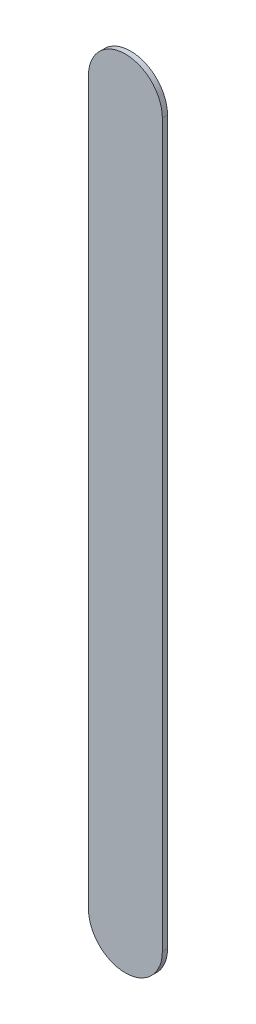
ISO-10303-21;
HEADER;
FILE_DESCRIPTION(('STEP AP214'),'2;1');
FILE_NAME('part.step','',(''),(''),'','','');
FILE_SCHEMA(('AUTOMOTIVE_DESIGN { 1 0 10303 214 1 1 1 1 }'));
ENDSEC;
DATA;
#1=APPLICATION_CONTEXT('core data for automotive mechanical design processes');
#2=APPLICATION_PROTOCOL_DEFINITION('international standard','automotive_design',2000,#1);
#3=PRODUCT_CONTEXT('',#1,'mechanical');
#4=PRODUCT('Part','Part','',(#3));
#5=PRODUCT_RELATED_PRODUCT_CATEGORY('part','',(#4));
#6=PRODUCT_DEFINITION_FORMATION('','',#4);
#7=PRODUCT_DEFINITION_CONTEXT('part definition',#1,'design');
#8=PRODUCT_DEFINITION('design','',#6,#7);
#9=PRODUCT_DEFINITION_SHAPE('','',#8);
#10=(LENGTH_UNIT() NAMED_UNIT(*) SI_UNIT(.MILLI.,.METRE.));
#11=(NAMED_UNIT(*) PLANE_ANGLE_UNIT() SI_UNIT($,.RADIAN.));
#12=(NAMED_UNIT(*) SI_UNIT($,.STERADIAN.) SOLID_ANGLE_UNIT());
#13=UNCERTAINTY_MEASURE_WITH_UNIT(LENGTH_MEASURE(1.E-05),#10,'distance_accuracy_value','');
#14=(GEOMETRIC_REPRESENTATION_CONTEXT(3) GLOBAL_UNCERTAINTY_ASSIGNED_CONTEXT((#13)) GLOBAL_UNIT_ASSIGNED_CONTEXT((#10,
#11,#12)) REPRESENTATION_CONTEXT('',''));
#15=CARTESIAN_POINT('',(0.,0.,0.));
#16=DIRECTION('',(0.,0.,1.));
#17=DIRECTION('',(1.,0.,0.));
#18=AXIS2_PLACEMENT_3D('',#15,#16,#17);
#19=CARTESIAN_POINT('',(75.75,-119.,1.635));
#20=DIRECTION('',(0.,0.,1.));
#21=DIRECTION('',(1.,0.,0.));
#22=AXIS2_PLACEMENT_3D('',#19,#20,#21);
#23=PLANE('',#22);
#24=DIRECTION('',(0.,1.,0.));
#25=VECTOR('',#24,1.);
#26=CARTESIAN_POINT('',(75.75,-119.,1.635));
#27=LINE('',#26,#25);
#28=CARTESIAN_POINT('',(75.75,-119.,1.635));
#29=VERTEX_POINT('',#28);
#30=CARTESIAN_POINT('',(75.75,-114.11,1.635));
#31=VERTEX_POINT('',#30);
#32=EDGE_CURVE('E87',#29,#31,#27,.T.);
#33=ORIENTED_EDGE('',*,*,#32,.T.);
#34=CARTESIAN_POINT('',(75.5,-114.11,1.635));
#35=DIRECTION('',(0.,0.,1.));
#36=DIRECTION('',(1.,0.,0.));
#37=AXIS2_PLACEMENT_3D('',#34,#35,#36);
#38=CIRCLE('',#37,0.25);
#39=CARTESIAN_POINT('',(75.25,-114.11,1.635));
#40=VERTEX_POINT('',#39);
#41=EDGE_CURVE('E105',#31,#40,#38,.T.);
#42=ORIENTED_EDGE('',*,*,#41,.T.);
#43=DIRECTION('',(0.,-1.,0.));
#44=VECTOR('',#43,1.);
#45=CARTESIAN_POINT('',(75.25,-114.11,1.635));
#46=LINE('',#45,#44);
#47=CARTESIAN_POINT('',(75.25,-119.,1.635));
#48=VERTEX_POINT('',#47);
#49=EDGE_CURVE('E49',#40,#48,#46,.T.);
#50=ORIENTED_EDGE('',*,*,#49,.T.);
#51=CARTESIAN_POINT('',(75.5,-119.,1.635));
#52=DIRECTION('',(0.,0.,1.));
#53=DIRECTION('',(-1.,0.,0.));
#54=AXIS2_PLACEMENT_3D('',#51,#52,#53);
#55=CIRCLE('',#54,0.25);
#56=EDGE_CURVE('E11',#48,#29,#55,.T.);
#57=ORIENTED_EDGE('',*,*,#56,.T.);
#58=EDGE_LOOP('',(#33,#42,#50,#57));
#59=FACE_BOUND('',#58,.T.);
#60=ADVANCED_FACE('F17',(#59),#23,.T.);
#61=CARTESIAN_POINT('',(75.75,-119.,1.6));
#62=DIRECTION('',(0.,0.,1.));
#63=DIRECTION('',(1.,0.,0.));
#64=AXIS2_PLACEMENT_3D('',#61,#62,#63);
#65=PLANE('',#64);
#66=CARTESIAN_POINT('',(75.5,-119.,1.6));
#67=DIRECTION('',(0.,0.,1.));
#68=DIRECTION('',(-1.,0.,0.));
#69=AXIS2_PLACEMENT_3D('',#66,#67,#68);
#70=CIRCLE('',#69,0.25);
#71=CARTESIAN_POINT('',(75.25,-119.,1.6));
#72=VERTEX_POINT('',#71);
#73=CARTESIAN_POINT('',(75.75,-119.,1.6));
#74=VERTEX_POINT('',#73);
#75=EDGE_CURVE('E26',#72,#74,#70,.T.);
#76=ORIENTED_EDGE('',*,*,#75,.F.);
#77=DIRECTION('',(0.,-1.,0.));
#78=VECTOR('',#77,1.);
#79=CARTESIAN_POINT('',(75.25,-114.11,1.6));
#80=LINE('',#79,#78);
#81=CARTESIAN_POINT('',(75.25,-114.11,1.6));
#82=VERTEX_POINT('',#81);
#83=EDGE_CURVE('E58',#82,#72,#80,.T.);
#84=ORIENTED_EDGE('',*,*,#83,.F.);
#85=CARTESIAN_POINT('',(75.5,-114.11,1.6));
#86=DIRECTION('',(0.,0.,1.));
#87=DIRECTION('',(1.,0.,0.));
#88=AXIS2_PLACEMENT_3D('',#85,#86,#87);
#89=CIRCLE('',#88,0.25);
#90=CARTESIAN_POINT('',(75.75,-114.11,1.6));
#91=VERTEX_POINT('',#90);
#92=EDGE_CURVE('E89',#91,#82,#89,.T.);
#93=ORIENTED_EDGE('',*,*,#92,.F.);
#94=DIRECTION('',(0.,1.,0.));
#95=VECTOR('',#94,1.);
#96=CARTESIAN_POINT('',(75.75,-119.,1.6));
#97=LINE('',#96,#95);
#98=EDGE_CURVE('E86',#74,#91,#97,.T.);
#99=ORIENTED_EDGE('',*,*,#98,.F.);
#100=EDGE_LOOP('',(#76,#84,#93,#99));
#101=FACE_BOUND('',#100,.T.);
#102=ADVANCED_FACE('F91',(#101),#65,.F.);
#103=CARTESIAN_POINT('',(75.5,-119.,1.6));
#104=DIRECTION('',(0.,0.,-1.));
#105=DIRECTION('',(-1.,0.,0.));
#106=AXIS2_PLACEMENT_3D('',#103,#104,#105);
#107=CYLINDRICAL_SURFACE('',#106,0.25);
#108=ORIENTED_EDGE('',*,*,#75,.T.);
#109=DIRECTION('',(0.,0.,1.));
#110=VECTOR('',#109,1.);
#111=CARTESIAN_POINT('',(75.75,-119.,1.6));
#112=LINE('',#111,#110);
#113=EDGE_CURVE('E76',#74,#29,#112,.T.);
#114=ORIENTED_EDGE('',*,*,#113,.T.);
#115=ORIENTED_EDGE('',*,*,#56,.F.);
#116=DIRECTION('',(0.,0.,1.));
#117=VECTOR('',#116,1.);
#118=CARTESIAN_POINT('',(75.25,-119.,1.6));
#119=LINE('',#118,#117);
#120=EDGE_CURVE('E78',#72,#48,#119,.T.);
#121=ORIENTED_EDGE('',*,*,#120,.F.);
#122=EDGE_LOOP('',(#108,#114,#115,#121));
#123=FACE_BOUND('',#122,.T.);
#124=ADVANCED_FACE('F75',(#123),#107,.T.);
#125=CARTESIAN_POINT('',(75.25,-114.11,1.6));
#126=DIRECTION('',(1.,0.,0.));
#127=DIRECTION('',(0.,1.,0.));
#128=AXIS2_PLACEMENT_3D('',#125,#126,#127);
#129=PLANE('',#128);
#130=ORIENTED_EDGE('',*,*,#83,.T.);
#131=ORIENTED_EDGE('',*,*,#120,.T.);
#132=ORIENTED_EDGE('',*,*,#49,.F.);
#133=DIRECTION('',(0.,0.,1.));
#134=VECTOR('',#133,1.);
#135=CARTESIAN_POINT('',(75.25,-114.11,1.6));
#136=LINE('',#135,#134);
#137=EDGE_CURVE('E110',#82,#40,#136,.T.);
#138=ORIENTED_EDGE('',*,*,#137,.F.);
#139=EDGE_LOOP('',(#130,#131,#132,#138));
#140=FACE_BOUND('',#139,.T.);
#141=ADVANCED_FACE('F120',(#140),#129,.F.);
#142=CARTESIAN_POINT('',(75.5,-114.11,1.6));
#143=DIRECTION('',(0.,0.,-1.));
#144=DIRECTION('',(1.,0.,0.));
#145=AXIS2_PLACEMENT_3D('',#142,#143,#144);
#146=CYLINDRICAL_SURFACE('',#145,0.25);
#147=ORIENTED_EDGE('',*,*,#92,.T.);
#148=ORIENTED_EDGE('',*,*,#137,.T.);
#149=ORIENTED_EDGE('',*,*,#41,.F.);
#150=DIRECTION('',(0.,0.,1.));
#151=VECTOR('',#150,1.);
#152=CARTESIAN_POINT('',(75.75,-114.11,1.6));
#153=LINE('',#152,#151);
#154=EDGE_CURVE('E95',#91,#31,#153,.T.);
#155=ORIENTED_EDGE('',*,*,#154,.F.);
#156=EDGE_LOOP('',(#147,#148,#149,#155));
#157=FACE_BOUND('',#156,.T.);
#158=ADVANCED_FACE('F122',(#157),#146,.T.);
#159=CARTESIAN_POINT('',(75.75,-119.,1.6));
#160=DIRECTION('',(-1.,0.,0.));
#161=DIRECTION('',(0.,0.,1.));
#162=AXIS2_PLACEMENT_3D('',#159,#160,#161);
#163=PLANE('',#162);
#164=ORIENTED_EDGE('',*,*,#98,.T.);
#165=ORIENTED_EDGE('',*,*,#154,.T.);
#166=ORIENTED_EDGE('',*,*,#32,.F.);
#167=ORIENTED_EDGE('',*,*,#113,.F.);
#168=EDGE_LOOP('',(#164,#165,#166,#167));
#169=FACE_BOUND('',#168,.T.);
#170=ADVANCED_FACE('F84',(#169),#163,.F.);
#171=CLOSED_SHELL('',(#60,#102,#124,#141,#158,#170));
#172=MANIFOLD_SOLID_BREP('B1',#171);
#173=ADVANCED_BREP_SHAPE_REPRESENTATION('',(#18,#172),#14);
#174=SHAPE_DEFINITION_REPRESENTATION(#9,#173);
ENDSEC;
END-ISO-10303-21;
